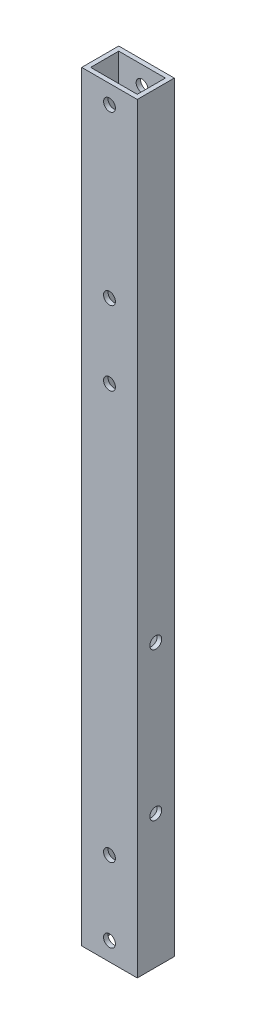
ISO-10303-21;
HEADER;
FILE_DESCRIPTION(('STEP AP214'),'2;1');
FILE_NAME('part.step','',(''),(''),'','','');
FILE_SCHEMA(('AUTOMOTIVE_DESIGN { 1 0 10303 214 1 1 1 1 }'));
ENDSEC;
DATA;
#1=APPLICATION_CONTEXT('core data for automotive mechanical design processes');
#2=APPLICATION_PROTOCOL_DEFINITION('international standard','automotive_design',2000,#1);
#3=PRODUCT_CONTEXT('',#1,'mechanical');
#4=PRODUCT('Part','Part','',(#3));
#5=PRODUCT_RELATED_PRODUCT_CATEGORY('part','',(#4));
#6=PRODUCT_DEFINITION_FORMATION('','',#4);
#7=PRODUCT_DEFINITION_CONTEXT('part definition',#1,'design');
#8=PRODUCT_DEFINITION('design','',#6,#7);
#9=PRODUCT_DEFINITION_SHAPE('','',#8);
#10=(LENGTH_UNIT() NAMED_UNIT(*) SI_UNIT(.MILLI.,.METRE.));
#11=(NAMED_UNIT(*) PLANE_ANGLE_UNIT() SI_UNIT($,.RADIAN.));
#12=(NAMED_UNIT(*) SI_UNIT($,.STERADIAN.) SOLID_ANGLE_UNIT());
#13=UNCERTAINTY_MEASURE_WITH_UNIT(LENGTH_MEASURE(1.E-05),#10,'distance_accuracy_value','');
#14=(GEOMETRIC_REPRESENTATION_CONTEXT(3) GLOBAL_UNCERTAINTY_ASSIGNED_CONTEXT((#13)) GLOBAL_UNIT_ASSIGNED_CONTEXT((#10,
#11,#12)) REPRESENTATION_CONTEXT('',''));
#15=CARTESIAN_POINT('',(0.,0.,0.));
#16=DIRECTION('',(0.,0.,1.));
#17=DIRECTION('',(1.,0.,0.));
#18=AXIS2_PLACEMENT_3D('',#15,#16,#17);
#19=CARTESIAN_POINT('',(7.5,110.,-5.));
#20=DIRECTION('',(-1.,0.,0.));
#21=DIRECTION('',(0.,0.,1.));
#22=AXIS2_PLACEMENT_3D('',#19,#20,#21);
#23=PLANE('',#22);
#24=CARTESIAN_POINT('',(7.5,-34.,0.));
#25=DIRECTION('',(-1.,0.,0.));
#26=DIRECTION('',(0.,0.,1.));
#27=AXIS2_PLACEMENT_3D('',#24,#25,#26);
#28=CIRCLE('',#27,1.6);
#29=CARTESIAN_POINT('',(7.5,-34.,1.60000000000005));
#30=VERTEX_POINT('',#29);
#31=EDGE_CURVE('E169',#30,#30,#28,.T.);
#32=ORIENTED_EDGE('',*,*,#31,.T.);
#33=EDGE_LOOP('',(#32));
#34=FACE_BOUND('',#33,.T.);
#35=CARTESIAN_POINT('',(7.5,-74.,0.));
#36=DIRECTION('',(-1.,0.,0.));
#37=DIRECTION('',(0.,0.,1.));
#38=AXIS2_PLACEMENT_3D('',#35,#36,#37);
#39=CIRCLE('',#38,1.6);
#40=CARTESIAN_POINT('',(7.5,-74.,1.60000000000007));
#41=VERTEX_POINT('',#40);
#42=EDGE_CURVE('E138',#41,#41,#39,.T.);
#43=ORIENTED_EDGE('',*,*,#42,.T.);
#44=EDGE_LOOP('',(#43));
#45=FACE_BOUND('',#44,.T.);
#46=DIRECTION('',(0.,0.,-1.));
#47=VECTOR('',#46,1.);
#48=CARTESIAN_POINT('',(7.5,95.5,5.));
#49=LINE('',#48,#47);
#50=CARTESIAN_POINT('',(7.5,95.5,5.));
#51=VERTEX_POINT('',#50);
#52=CARTESIAN_POINT('',(7.5,95.5,-5.));
#53=VERTEX_POINT('',#52);
#54=EDGE_CURVE('E96',#51,#53,#49,.T.);
#55=ORIENTED_EDGE('',*,*,#54,.F.);
#56=DIRECTION('',(0.,-1.,0.));
#57=VECTOR('',#56,1.);
#58=CARTESIAN_POINT('',(7.5,110.,5.));
#59=LINE('',#58,#57);
#60=CARTESIAN_POINT('',(7.5,-110.,5.));
#61=VERTEX_POINT('',#60);
#62=EDGE_CURVE('E106',#51,#61,#59,.T.);
#63=ORIENTED_EDGE('',*,*,#62,.T.);
#64=DIRECTION('',(0.,0.,-1.));
#65=VECTOR('',#64,1.);
#66=CARTESIAN_POINT('',(7.5,-110.,-5.));
#67=LINE('',#66,#65);
#68=CARTESIAN_POINT('',(7.5,-110.,-5.));
#69=VERTEX_POINT('',#68);
#70=EDGE_CURVE('E212',#61,#69,#67,.T.);
#71=ORIENTED_EDGE('',*,*,#70,.T.);
#72=DIRECTION('',(0.,-1.,0.));
#73=VECTOR('',#72,1.);
#74=CARTESIAN_POINT('',(7.5,110.,-5.));
#75=LINE('',#74,#73);
#76=EDGE_CURVE('E40',#53,#69,#75,.T.);
#77=ORIENTED_EDGE('',*,*,#76,.F.);
#78=EDGE_LOOP('',(#55,#63,#71,#77));
#79=FACE_BOUND('',#78,.T.);
#80=ADVANCED_FACE('F32',(#34,#45,#79),#23,.F.);
#81=CARTESIAN_POINT('',(-7.5,110.,-5.));
#82=DIRECTION('',(0.,0.,1.));
#83=DIRECTION('',(1.,0.,0.));
#84=AXIS2_PLACEMENT_3D('',#81,#82,#83);
#85=PLANE('',#84);
#86=CARTESIAN_POINT('',(0.,90.5,-5.));
#87=DIRECTION('',(0.,0.,-1.));
#88=DIRECTION('',(-1.,0.,0.));
#89=AXIS2_PLACEMENT_3D('',#86,#87,#88);
#90=CIRCLE('',#89,1.60000000000001);
#91=CARTESIAN_POINT('',(-1.60000000000001,90.5,-5.));
#92=VERTEX_POINT('',#91);
#93=EDGE_CURVE('E384',#92,#92,#90,.T.);
#94=ORIENTED_EDGE('',*,*,#93,.F.);
#95=EDGE_LOOP('',(#94));
#96=FACE_BOUND('',#95,.T.);
#97=CARTESIAN_POINT('',(0.,-105.,-5.));
#98=DIRECTION('',(0.,0.,-1.));
#99=DIRECTION('',(-1.,0.,0.));
#100=AXIS2_PLACEMENT_3D('',#97,#98,#99);
#101=CIRCLE('',#100,1.60000000000001);
#102=CARTESIAN_POINT('',(-1.60000000000001,-105.,-5.));
#103=VERTEX_POINT('',#102);
#104=EDGE_CURVE('E178',#103,#103,#101,.T.);
#105=ORIENTED_EDGE('',*,*,#104,.F.);
#106=EDGE_LOOP('',(#105));
#107=FACE_BOUND('',#106,.T.);
#108=CARTESIAN_POINT('',(0.,-85.,-5.));
#109=DIRECTION('',(0.,0.,-1.));
#110=DIRECTION('',(-1.,0.,0.));
#111=AXIS2_PLACEMENT_3D('',#108,#109,#110);
#112=CIRCLE('',#111,1.6);
#113=CARTESIAN_POINT('',(-1.6,-85.,-5.));
#114=VERTEX_POINT('',#113);
#115=EDGE_CURVE('E128',#114,#114,#112,.T.);
#116=ORIENTED_EDGE('',*,*,#115,.F.);
#117=EDGE_LOOP('',(#116));
#118=FACE_BOUND('',#117,.T.);
#119=CARTESIAN_POINT('',(0.,45.2765137036184,-5.));
#120=DIRECTION('',(0.,0.,-1.));
#121=DIRECTION('',(-1.,0.,0.));
#122=AXIS2_PLACEMENT_3D('',#119,#120,#121);
#123=CIRCLE('',#122,1.6);
#124=CARTESIAN_POINT('',(-1.6,45.2765137036184,-5.));
#125=VERTEX_POINT('',#124);
#126=EDGE_CURVE('E161',#125,#125,#123,.T.);
#127=ORIENTED_EDGE('',*,*,#126,.F.);
#128=EDGE_LOOP('',(#127));
#129=FACE_BOUND('',#128,.T.);
#130=CARTESIAN_POINT('',(0.,25.2765137036184,-5.));
#131=DIRECTION('',(0.,0.,-1.));
#132=DIRECTION('',(-1.,0.,0.));
#133=AXIS2_PLACEMENT_3D('',#130,#131,#132);
#134=CIRCLE('',#133,1.6);
#135=CARTESIAN_POINT('',(-1.6,25.2765137036184,-5.));
#136=VERTEX_POINT('',#135);
#137=EDGE_CURVE('E239',#136,#136,#134,.T.);
#138=ORIENTED_EDGE('',*,*,#137,.F.);
#139=EDGE_LOOP('',(#138));
#140=FACE_BOUND('',#139,.T.);
#141=DIRECTION('',(-1.,0.,0.));
#142=VECTOR('',#141,1.);
#143=CARTESIAN_POINT('',(7.5,95.5,-5.));
#144=LINE('',#143,#142);
#145=CARTESIAN_POINT('',(-7.5,95.5,-5.));
#146=VERTEX_POINT('',#145);
#147=EDGE_CURVE('E108',#53,#146,#144,.T.);
#148=ORIENTED_EDGE('',*,*,#147,.F.);
#149=ORIENTED_EDGE('',*,*,#76,.T.);
#150=DIRECTION('',(-1.,0.,0.));
#151=VECTOR('',#150,1.);
#152=CARTESIAN_POINT('',(-7.5,-110.,-5.));
#153=LINE('',#152,#151);
#154=CARTESIAN_POINT('',(-7.5,-110.,-5.));
#155=VERTEX_POINT('',#154);
#156=EDGE_CURVE('E214',#69,#155,#153,.T.);
#157=ORIENTED_EDGE('',*,*,#156,.T.);
#158=DIRECTION('',(0.,-1.,0.));
#159=VECTOR('',#158,1.);
#160=CARTESIAN_POINT('',(-7.5,110.,-5.));
#161=LINE('',#160,#159);
#162=EDGE_CURVE('E116',#146,#155,#161,.T.);
#163=ORIENTED_EDGE('',*,*,#162,.F.);
#164=EDGE_LOOP('',(#148,#149,#157,#163));
#165=FACE_BOUND('',#164,.T.);
#166=ADVANCED_FACE('F226',(#96,#107,#118,#129,#140,#165),#85,.F.);
#167=CARTESIAN_POINT('',(-7.5,110.,-5.));
#168=DIRECTION('',(1.,0.,0.));
#169=DIRECTION('',(0.,0.,-1.));
#170=AXIS2_PLACEMENT_3D('',#167,#168,#169);
#171=PLANE('',#170);
#172=CARTESIAN_POINT('',(-7.5,-34.,0.));
#173=DIRECTION('',(-1.,0.,0.));
#174=DIRECTION('',(0.,0.,1.));
#175=AXIS2_PLACEMENT_3D('',#172,#173,#174);
#176=CIRCLE('',#175,1.6);
#177=CARTESIAN_POINT('',(-7.5,-34.,1.60000000000005));
#178=VERTEX_POINT('',#177);
#179=EDGE_CURVE('E154',#178,#178,#176,.T.);
#180=ORIENTED_EDGE('',*,*,#179,.F.);
#181=EDGE_LOOP('',(#180));
#182=FACE_BOUND('',#181,.T.);
#183=CARTESIAN_POINT('',(-7.5,-74.,0.));
#184=DIRECTION('',(-1.,0.,0.));
#185=DIRECTION('',(0.,0.,1.));
#186=AXIS2_PLACEMENT_3D('',#183,#184,#185);
#187=CIRCLE('',#186,1.6);
#188=CARTESIAN_POINT('',(-7.5,-74.,1.60000000000008));
#189=VERTEX_POINT('',#188);
#190=EDGE_CURVE('E166',#189,#189,#187,.T.);
#191=ORIENTED_EDGE('',*,*,#190,.F.);
#192=EDGE_LOOP('',(#191));
#193=FACE_BOUND('',#192,.T.);
#194=DIRECTION('',(0.,0.,1.));
#195=VECTOR('',#194,1.);
#196=CARTESIAN_POINT('',(-7.5,95.5,-5.));
#197=LINE('',#196,#195);
#198=CARTESIAN_POINT('',(-7.5,95.5,5.));
#199=VERTEX_POINT('',#198);
#200=EDGE_CURVE('E47',#146,#199,#197,.T.);
#201=ORIENTED_EDGE('',*,*,#200,.F.);
#202=ORIENTED_EDGE('',*,*,#162,.T.);
#203=DIRECTION('',(0.,0.,1.));
#204=VECTOR('',#203,1.);
#205=CARTESIAN_POINT('',(-7.5,-110.,-5.));
#206=LINE('',#205,#204);
#207=CARTESIAN_POINT('',(-7.5,-110.,5.));
#208=VERTEX_POINT('',#207);
#209=EDGE_CURVE('E118',#155,#208,#206,.T.);
#210=ORIENTED_EDGE('',*,*,#209,.T.);
#211=DIRECTION('',(0.,-1.,0.));
#212=VECTOR('',#211,1.);
#213=CARTESIAN_POINT('',(-7.5,110.,5.));
#214=LINE('',#213,#212);
#215=EDGE_CURVE('E114',#199,#208,#214,.T.);
#216=ORIENTED_EDGE('',*,*,#215,.F.);
#217=EDGE_LOOP('',(#201,#202,#210,#216));
#218=FACE_BOUND('',#217,.T.);
#219=ADVANCED_FACE('F219',(#182,#193,#218),#171,.F.);
#220=CARTESIAN_POINT('',(-7.5,110.,5.));
#221=DIRECTION('',(0.,0.,-1.));
#222=DIRECTION('',(-1.,0.,0.));
#223=AXIS2_PLACEMENT_3D('',#220,#221,#222);
#224=PLANE('',#223);
#225=CARTESIAN_POINT('',(0.,90.5,5.));
#226=DIRECTION('',(0.,0.,-1.));
#227=DIRECTION('',(-1.,0.,0.));
#228=AXIS2_PLACEMENT_3D('',#225,#226,#227);
#229=CIRCLE('',#228,1.60000000000001);
#230=CARTESIAN_POINT('',(-1.60000000000001,90.5,5.));
#231=VERTEX_POINT('',#230);
#232=EDGE_CURVE('E101',#231,#231,#229,.T.);
#233=ORIENTED_EDGE('',*,*,#232,.T.);
#234=EDGE_LOOP('',(#233));
#235=FACE_BOUND('',#234,.T.);
#236=CARTESIAN_POINT('',(0.,-105.,5.));
#237=DIRECTION('',(0.,0.,-1.));
#238=DIRECTION('',(-1.,0.,0.));
#239=AXIS2_PLACEMENT_3D('',#236,#237,#238);
#240=CIRCLE('',#239,1.60000000000001);
#241=CARTESIAN_POINT('',(-1.60000000000001,-105.,5.));
#242=VERTEX_POINT('',#241);
#243=EDGE_CURVE('E133',#242,#242,#240,.T.);
#244=ORIENTED_EDGE('',*,*,#243,.T.);
#245=EDGE_LOOP('',(#244));
#246=FACE_BOUND('',#245,.T.);
#247=CARTESIAN_POINT('',(0.,-85.,5.));
#248=DIRECTION('',(0.,0.,-1.));
#249=DIRECTION('',(-1.,0.,0.));
#250=AXIS2_PLACEMENT_3D('',#247,#248,#249);
#251=CIRCLE('',#250,1.6);
#252=CARTESIAN_POINT('',(-1.6,-85.,5.));
#253=VERTEX_POINT('',#252);
#254=EDGE_CURVE('E189',#253,#253,#251,.T.);
#255=ORIENTED_EDGE('',*,*,#254,.T.);
#256=EDGE_LOOP('',(#255));
#257=FACE_BOUND('',#256,.T.);
#258=CARTESIAN_POINT('',(0.,45.2765137036184,5.));
#259=DIRECTION('',(0.,0.,-1.));
#260=DIRECTION('',(-1.,0.,0.));
#261=AXIS2_PLACEMENT_3D('',#258,#259,#260);
#262=CIRCLE('',#261,1.6);
#263=CARTESIAN_POINT('',(-1.6,45.2765137036184,5.));
#264=VERTEX_POINT('',#263);
#265=EDGE_CURVE('E241',#264,#264,#262,.T.);
#266=ORIENTED_EDGE('',*,*,#265,.T.);
#267=EDGE_LOOP('',(#266));
#268=FACE_BOUND('',#267,.T.);
#269=CARTESIAN_POINT('',(0.,25.2765137036184,5.));
#270=DIRECTION('',(0.,0.,-1.));
#271=DIRECTION('',(-1.,0.,0.));
#272=AXIS2_PLACEMENT_3D('',#269,#270,#271);
#273=CIRCLE('',#272,1.6);
#274=CARTESIAN_POINT('',(-1.6,25.2765137036184,5.));
#275=VERTEX_POINT('',#274);
#276=EDGE_CURVE('E147',#275,#275,#273,.T.);
#277=ORIENTED_EDGE('',*,*,#276,.T.);
#278=EDGE_LOOP('',(#277));
#279=FACE_BOUND('',#278,.T.);
#280=DIRECTION('',(1.,0.,0.));
#281=VECTOR('',#280,1.);
#282=CARTESIAN_POINT('',(-7.5,95.5,5.));
#283=LINE('',#282,#281);
#284=EDGE_CURVE('E93',#199,#51,#283,.T.);
#285=ORIENTED_EDGE('',*,*,#284,.F.);
#286=ORIENTED_EDGE('',*,*,#215,.T.);
#287=DIRECTION('',(1.,0.,0.));
#288=VECTOR('',#287,1.);
#289=CARTESIAN_POINT('',(-7.5,-110.,5.));
#290=LINE('',#289,#288);
#291=EDGE_CURVE('E112',#208,#61,#290,.T.);
#292=ORIENTED_EDGE('',*,*,#291,.T.);
#293=ORIENTED_EDGE('',*,*,#62,.F.);
#294=EDGE_LOOP('',(#285,#286,#292,#293));
#295=FACE_BOUND('',#294,.T.);
#296=ADVANCED_FACE('F110',(#235,#246,#257,#268,#279,#295),#224,.F.);
#297=CARTESIAN_POINT('',(-6.3,110.,-3.8));
#298=DIRECTION('',(1.,0.,0.));
#299=DIRECTION('',(0.,0.,-1.));
#300=AXIS2_PLACEMENT_3D('',#297,#298,#299);
#301=PLANE('',#300);
#302=CARTESIAN_POINT('',(-6.3,-74.,0.));
#303=DIRECTION('',(1.,0.,0.));
#304=DIRECTION('',(0.,0.,-1.));
#305=AXIS2_PLACEMENT_3D('',#302,#303,#304);
#306=CIRCLE('',#305,1.6);
#307=CARTESIAN_POINT('',(-6.3,-74.,-1.59999999999992));
#308=VERTEX_POINT('',#307);
#309=EDGE_CURVE('E142',#308,#308,#306,.T.);
#310=ORIENTED_EDGE('',*,*,#309,.F.);
#311=EDGE_LOOP('',(#310));
#312=FACE_BOUND('',#311,.T.);
#313=CARTESIAN_POINT('',(-6.3,-34.,0.));
#314=DIRECTION('',(1.,0.,0.));
#315=DIRECTION('',(0.,0.,-1.));
#316=AXIS2_PLACEMENT_3D('',#313,#314,#315);
#317=CIRCLE('',#316,1.6);
#318=CARTESIAN_POINT('',(-6.3,-34.,-1.59999999999995));
#319=VERTEX_POINT('',#318);
#320=EDGE_CURVE('E137',#319,#319,#317,.T.);
#321=ORIENTED_EDGE('',*,*,#320,.F.);
#322=EDGE_LOOP('',(#321));
#323=FACE_BOUND('',#322,.T.);
#324=DIRECTION('',(0.,-1.,0.));
#325=VECTOR('',#324,1.);
#326=CARTESIAN_POINT('',(-6.3,110.,-3.8));
#327=LINE('',#326,#325);
#328=CARTESIAN_POINT('',(-6.3,95.5,-3.8));
#329=VERTEX_POINT('',#328);
#330=CARTESIAN_POINT('',(-6.3,-110.,-3.8));
#331=VERTEX_POINT('',#330);
#332=EDGE_CURVE('E204',#329,#331,#327,.T.);
#333=ORIENTED_EDGE('',*,*,#332,.F.);
#334=DIRECTION('',(0.,0.,1.));
#335=VECTOR('',#334,1.);
#336=CARTESIAN_POINT('',(-6.3,95.5,-3.8));
#337=LINE('',#336,#335);
#338=CARTESIAN_POINT('',(-6.3,95.5,3.8));
#339=VERTEX_POINT('',#338);
#340=EDGE_CURVE('E55',#329,#339,#337,.T.);
#341=ORIENTED_EDGE('',*,*,#340,.T.);
#342=DIRECTION('',(0.,-1.,0.));
#343=VECTOR('',#342,1.);
#344=CARTESIAN_POINT('',(-6.3,110.,3.8));
#345=LINE('',#344,#343);
#346=CARTESIAN_POINT('',(-6.3,-110.,3.8));
#347=VERTEX_POINT('',#346);
#348=EDGE_CURVE('E210',#339,#347,#345,.T.);
#349=ORIENTED_EDGE('',*,*,#348,.T.);
#350=DIRECTION('',(0.,0.,1.));
#351=VECTOR('',#350,1.);
#352=CARTESIAN_POINT('',(-6.3,-110.,-3.8));
#353=LINE('',#352,#351);
#354=EDGE_CURVE('E192',#331,#347,#353,.T.);
#355=ORIENTED_EDGE('',*,*,#354,.F.);
#356=EDGE_LOOP('',(#333,#341,#349,#355));
#357=FACE_BOUND('',#356,.T.);
#358=ADVANCED_FACE('F306',(#312,#323,#357),#301,.T.);
#359=CARTESIAN_POINT('',(-6.3,110.,3.8));
#360=DIRECTION('',(0.,0.,-1.));
#361=DIRECTION('',(-1.,0.,0.));
#362=AXIS2_PLACEMENT_3D('',#359,#360,#361);
#363=PLANE('',#362);
#364=CARTESIAN_POINT('',(0.,90.5,3.8));
#365=DIRECTION('',(0.,0.,-1.));
#366=DIRECTION('',(-1.,0.,0.));
#367=AXIS2_PLACEMENT_3D('',#364,#365,#366);
#368=CIRCLE('',#367,1.60000000000001);
#369=CARTESIAN_POINT('',(-1.60000000000001,90.5,3.8));
#370=VERTEX_POINT('',#369);
#371=EDGE_CURVE('E386',#370,#370,#368,.T.);
#372=ORIENTED_EDGE('',*,*,#371,.F.);
#373=EDGE_LOOP('',(#372));
#374=FACE_BOUND('',#373,.T.);
#375=CARTESIAN_POINT('',(0.,25.2765137036184,3.8));
#376=DIRECTION('',(0.,0.,-1.));
#377=DIRECTION('',(-1.,0.,0.));
#378=AXIS2_PLACEMENT_3D('',#375,#376,#377);
#379=CIRCLE('',#378,1.6);
#380=CARTESIAN_POINT('',(-1.6,25.2765137036184,3.8));
#381=VERTEX_POINT('',#380);
#382=EDGE_CURVE('E150',#381,#381,#379,.T.);
#383=ORIENTED_EDGE('',*,*,#382,.F.);
#384=EDGE_LOOP('',(#383));
#385=FACE_BOUND('',#384,.T.);
#386=CARTESIAN_POINT('',(0.,45.2765137036184,3.8));
#387=DIRECTION('',(0.,0.,-1.));
#388=DIRECTION('',(-1.,0.,0.));
#389=AXIS2_PLACEMENT_3D('',#386,#387,#388);
#390=CIRCLE('',#389,1.6);
#391=CARTESIAN_POINT('',(-1.6,45.2765137036184,3.8));
#392=VERTEX_POINT('',#391);
#393=EDGE_CURVE('E146',#392,#392,#390,.T.);
#394=ORIENTED_EDGE('',*,*,#393,.F.);
#395=EDGE_LOOP('',(#394));
#396=FACE_BOUND('',#395,.T.);
#397=CARTESIAN_POINT('',(0.,-85.,3.8));
#398=DIRECTION('',(0.,0.,-1.));
#399=DIRECTION('',(-1.,0.,0.));
#400=AXIS2_PLACEMENT_3D('',#397,#398,#399);
#401=CIRCLE('',#400,1.6);
#402=CARTESIAN_POINT('',(-1.6,-85.,3.8));
#403=VERTEX_POINT('',#402);
#404=EDGE_CURVE('E132',#403,#403,#401,.T.);
#405=ORIENTED_EDGE('',*,*,#404,.F.);
#406=EDGE_LOOP('',(#405));
#407=FACE_BOUND('',#406,.T.);
#408=CARTESIAN_POINT('',(0.,-105.,3.8));
#409=DIRECTION('',(0.,0.,-1.));
#410=DIRECTION('',(-1.,0.,0.));
#411=AXIS2_PLACEMENT_3D('',#408,#409,#410);
#412=CIRCLE('',#411,1.60000000000001);
#413=CARTESIAN_POINT('',(-1.60000000000001,-105.,3.8));
#414=VERTEX_POINT('',#413);
#415=EDGE_CURVE('E127',#414,#414,#412,.T.);
#416=ORIENTED_EDGE('',*,*,#415,.F.);
#417=EDGE_LOOP('',(#416));
#418=FACE_BOUND('',#417,.T.);
#419=ORIENTED_EDGE('',*,*,#348,.F.);
#420=DIRECTION('',(1.,0.,0.));
#421=VECTOR('',#420,1.);
#422=CARTESIAN_POINT('',(-6.3,95.5,3.8));
#423=LINE('',#422,#421);
#424=CARTESIAN_POINT('',(6.3,95.5,3.8));
#425=VERTEX_POINT('',#424);
#426=EDGE_CURVE('E233',#339,#425,#423,.T.);
#427=ORIENTED_EDGE('',*,*,#426,.T.);
#428=DIRECTION('',(0.,-1.,0.));
#429=VECTOR('',#428,1.);
#430=CARTESIAN_POINT('',(6.3,110.,3.8));
#431=LINE('',#430,#429);
#432=CARTESIAN_POINT('',(6.3,-110.,3.8));
#433=VERTEX_POINT('',#432);
#434=EDGE_CURVE('E208',#425,#433,#431,.T.);
#435=ORIENTED_EDGE('',*,*,#434,.T.);
#436=DIRECTION('',(1.,0.,0.));
#437=VECTOR('',#436,1.);
#438=CARTESIAN_POINT('',(-6.3,-110.,3.8));
#439=LINE('',#438,#437);
#440=EDGE_CURVE('E195',#347,#433,#439,.T.);
#441=ORIENTED_EDGE('',*,*,#440,.F.);
#442=EDGE_LOOP('',(#419,#427,#435,#441));
#443=FACE_BOUND('',#442,.T.);
#444=ADVANCED_FACE('F317',(#374,#385,#396,#407,#418,#443),#363,.T.);
#445=CARTESIAN_POINT('',(6.3,110.,-3.8));
#446=DIRECTION('',(-1.,0.,0.));
#447=DIRECTION('',(0.,0.,1.));
#448=AXIS2_PLACEMENT_3D('',#445,#446,#447);
#449=PLANE('',#448);
#450=CARTESIAN_POINT('',(6.3,-74.,0.));
#451=DIRECTION('',(-1.,0.,0.));
#452=DIRECTION('',(0.,0.,1.));
#453=AXIS2_PLACEMENT_3D('',#450,#451,#452);
#454=CIRCLE('',#453,1.6);
#455=CARTESIAN_POINT('',(6.3,-74.,1.60000000000007));
#456=VERTEX_POINT('',#455);
#457=EDGE_CURVE('E139',#456,#456,#454,.T.);
#458=ORIENTED_EDGE('',*,*,#457,.F.);
#459=EDGE_LOOP('',(#458));
#460=FACE_BOUND('',#459,.T.);
#461=CARTESIAN_POINT('',(6.3,-34.,0.));
#462=DIRECTION('',(-1.,0.,0.));
#463=DIRECTION('',(0.,0.,1.));
#464=AXIS2_PLACEMENT_3D('',#461,#462,#463);
#465=CIRCLE('',#464,1.6);
#466=CARTESIAN_POINT('',(6.3,-34.,1.60000000000005));
#467=VERTEX_POINT('',#466);
#468=EDGE_CURVE('E134',#467,#467,#465,.T.);
#469=ORIENTED_EDGE('',*,*,#468,.F.);
#470=EDGE_LOOP('',(#469));
#471=FACE_BOUND('',#470,.T.);
#472=ORIENTED_EDGE('',*,*,#434,.F.);
#473=DIRECTION('',(0.,0.,-1.));
#474=VECTOR('',#473,1.);
#475=CARTESIAN_POINT('',(6.3,95.5,-3.8));
#476=LINE('',#475,#474);
#477=CARTESIAN_POINT('',(6.3,95.5,-3.8));
#478=VERTEX_POINT('',#477);
#479=EDGE_CURVE('E228',#425,#478,#476,.T.);
#480=ORIENTED_EDGE('',*,*,#479,.T.);
#481=DIRECTION('',(0.,-1.,0.));
#482=VECTOR('',#481,1.);
#483=CARTESIAN_POINT('',(6.3,110.,-3.8));
#484=LINE('',#483,#482);
#485=CARTESIAN_POINT('',(6.3,-110.,-3.8));
#486=VERTEX_POINT('',#485);
#487=EDGE_CURVE('E206',#478,#486,#484,.T.);
#488=ORIENTED_EDGE('',*,*,#487,.T.);
#489=DIRECTION('',(0.,0.,-1.));
#490=VECTOR('',#489,1.);
#491=CARTESIAN_POINT('',(6.3,-110.,-3.8));
#492=LINE('',#491,#490);
#493=EDGE_CURVE('E198',#433,#486,#492,.T.);
#494=ORIENTED_EDGE('',*,*,#493,.F.);
#495=EDGE_LOOP('',(#472,#480,#488,#494));
#496=FACE_BOUND('',#495,.T.);
#497=ADVANCED_FACE('F321',(#460,#471,#496),#449,.T.);
#498=CARTESIAN_POINT('',(-6.3,110.,-3.8));
#499=DIRECTION('',(0.,0.,1.));
#500=DIRECTION('',(1.,0.,0.));
#501=AXIS2_PLACEMENT_3D('',#498,#499,#500);
#502=PLANE('',#501);
#503=CARTESIAN_POINT('',(0.,90.5,-3.8));
#504=DIRECTION('',(0.,0.,1.));
#505=DIRECTION('',(1.,0.,0.));
#506=AXIS2_PLACEMENT_3D('',#503,#504,#505);
#507=CIRCLE('',#506,1.60000000000001);
#508=CARTESIAN_POINT('',(1.60000000000001,90.5,-3.8));
#509=VERTEX_POINT('',#508);
#510=EDGE_CURVE('E35',#509,#509,#507,.T.);
#511=ORIENTED_EDGE('',*,*,#510,.F.);
#512=EDGE_LOOP('',(#511));
#513=FACE_BOUND('',#512,.T.);
#514=CARTESIAN_POINT('',(0.,25.2765137036184,-3.8));
#515=DIRECTION('',(0.,0.,1.));
#516=DIRECTION('',(1.,0.,0.));
#517=AXIS2_PLACEMENT_3D('',#514,#515,#516);
#518=CIRCLE('',#517,1.6);
#519=CARTESIAN_POINT('',(1.6,25.2765137036184,-3.8));
#520=VERTEX_POINT('',#519);
#521=EDGE_CURVE('E148',#520,#520,#518,.T.);
#522=ORIENTED_EDGE('',*,*,#521,.F.);
#523=EDGE_LOOP('',(#522));
#524=FACE_BOUND('',#523,.T.);
#525=CARTESIAN_POINT('',(0.,45.2765137036184,-3.8));
#526=DIRECTION('',(0.,0.,1.));
#527=DIRECTION('',(1.,0.,0.));
#528=AXIS2_PLACEMENT_3D('',#525,#526,#527);
#529=CIRCLE('',#528,1.6);
#530=CARTESIAN_POINT('',(1.6,45.2765137036184,-3.8));
#531=VERTEX_POINT('',#530);
#532=EDGE_CURVE('E143',#531,#531,#529,.T.);
#533=ORIENTED_EDGE('',*,*,#532,.F.);
#534=EDGE_LOOP('',(#533));
#535=FACE_BOUND('',#534,.T.);
#536=CARTESIAN_POINT('',(0.,-85.,-3.8));
#537=DIRECTION('',(0.,0.,1.));
#538=DIRECTION('',(1.,0.,0.));
#539=AXIS2_PLACEMENT_3D('',#536,#537,#538);
#540=CIRCLE('',#539,1.6);
#541=CARTESIAN_POINT('',(1.6,-85.,-3.8));
#542=VERTEX_POINT('',#541);
#543=EDGE_CURVE('E129',#542,#542,#540,.T.);
#544=ORIENTED_EDGE('',*,*,#543,.F.);
#545=EDGE_LOOP('',(#544));
#546=FACE_BOUND('',#545,.T.);
#547=CARTESIAN_POINT('',(0.,-105.,-3.8));
#548=DIRECTION('',(0.,0.,1.));
#549=DIRECTION('',(1.,0.,0.));
#550=AXIS2_PLACEMENT_3D('',#547,#548,#549);
#551=CIRCLE('',#550,1.60000000000001);
#552=CARTESIAN_POINT('',(1.60000000000001,-105.,-3.8));
#553=VERTEX_POINT('',#552);
#554=EDGE_CURVE('E124',#553,#553,#551,.T.);
#555=ORIENTED_EDGE('',*,*,#554,.F.);
#556=EDGE_LOOP('',(#555));
#557=FACE_BOUND('',#556,.T.);
#558=ORIENTED_EDGE('',*,*,#487,.F.);
#559=DIRECTION('',(-1.,0.,0.));
#560=VECTOR('',#559,1.);
#561=CARTESIAN_POINT('',(-6.3,95.5,-3.8));
#562=LINE('',#561,#560);
#563=EDGE_CURVE('E11',#478,#329,#562,.T.);
#564=ORIENTED_EDGE('',*,*,#563,.T.);
#565=ORIENTED_EDGE('',*,*,#332,.T.);
#566=DIRECTION('',(-1.,0.,0.));
#567=VECTOR('',#566,1.);
#568=CARTESIAN_POINT('',(-6.3,-110.,-3.8));
#569=LINE('',#568,#567);
#570=EDGE_CURVE('E201',#486,#331,#569,.T.);
#571=ORIENTED_EDGE('',*,*,#570,.F.);
#572=EDGE_LOOP('',(#558,#564,#565,#571));
#573=FACE_BOUND('',#572,.T.);
#574=ADVANCED_FACE('F314',(#513,#524,#535,#546,#557,#573),#502,.T.);
#575=CARTESIAN_POINT('',(0.,-110.,0.));
#576=DIRECTION('',(0.,1.,0.));
#577=DIRECTION('',(0.,0.,1.));
#578=AXIS2_PLACEMENT_3D('',#575,#576,#577);
#579=PLANE('',#578);
#580=ORIENTED_EDGE('',*,*,#70,.F.);
#581=ORIENTED_EDGE('',*,*,#291,.F.);
#582=ORIENTED_EDGE('',*,*,#209,.F.);
#583=ORIENTED_EDGE('',*,*,#156,.F.);
#584=EDGE_LOOP('',(#580,#581,#582,#583));
#585=FACE_BOUND('',#584,.T.);
#586=ORIENTED_EDGE('',*,*,#354,.T.);
#587=ORIENTED_EDGE('',*,*,#440,.T.);
#588=ORIENTED_EDGE('',*,*,#493,.T.);
#589=ORIENTED_EDGE('',*,*,#570,.T.);
#590=EDGE_LOOP('',(#586,#587,#588,#589));
#591=FACE_BOUND('',#590,.T.);
#592=ADVANCED_FACE('F223',(#585,#591),#579,.F.);
#593=CARTESIAN_POINT('',(0.,-105.,95.));
#594=DIRECTION('',(0.,0.,-1.));
#595=DIRECTION('',(-1.,0.,0.));
#596=AXIS2_PLACEMENT_3D('',#593,#594,#595);
#597=CYLINDRICAL_SURFACE('',#596,1.60000000000001);
#598=ORIENTED_EDGE('',*,*,#554,.T.);
#599=EDGE_LOOP('',(#598));
#600=FACE_BOUND('',#599,.T.);
#601=ORIENTED_EDGE('',*,*,#104,.T.);
#602=EDGE_LOOP('',(#601));
#603=FACE_BOUND('',#602,.T.);
#604=ADVANCED_FACE('F313',(#600,#603),#597,.F.);
#605=CARTESIAN_POINT('',(0.,-85.,95.));
#606=DIRECTION('',(0.,0.,-1.));
#607=DIRECTION('',(-1.,0.,0.));
#608=AXIS2_PLACEMENT_3D('',#605,#606,#607);
#609=CYLINDRICAL_SURFACE('',#608,1.6);
#610=ORIENTED_EDGE('',*,*,#543,.T.);
#611=EDGE_LOOP('',(#610));
#612=FACE_BOUND('',#611,.T.);
#613=ORIENTED_EDGE('',*,*,#115,.T.);
#614=EDGE_LOOP('',(#613));
#615=FACE_BOUND('',#614,.T.);
#616=ADVANCED_FACE('F331',(#612,#615),#609,.F.);
#617=ORIENTED_EDGE('',*,*,#415,.T.);
#618=EDGE_LOOP('',(#617));
#619=FACE_BOUND('',#618,.T.);
#620=ORIENTED_EDGE('',*,*,#243,.F.);
#621=EDGE_LOOP('',(#620));
#622=FACE_BOUND('',#621,.T.);
#623=ADVANCED_FACE('F333',(#619,#622),#597,.F.);
#624=ORIENTED_EDGE('',*,*,#404,.T.);
#625=EDGE_LOOP('',(#624));
#626=FACE_BOUND('',#625,.T.);
#627=ORIENTED_EDGE('',*,*,#254,.F.);
#628=EDGE_LOOP('',(#627));
#629=FACE_BOUND('',#628,.T.);
#630=ADVANCED_FACE('F290',(#626,#629),#609,.F.);
#631=CARTESIAN_POINT('',(7.5,-34.,0.));
#632=DIRECTION('',(-1.,0.,0.));
#633=DIRECTION('',(0.,0.,1.));
#634=AXIS2_PLACEMENT_3D('',#631,#632,#633);
#635=CYLINDRICAL_SURFACE('',#634,1.6);
#636=ORIENTED_EDGE('',*,*,#468,.T.);
#637=EDGE_LOOP('',(#636));
#638=FACE_BOUND('',#637,.T.);
#639=ORIENTED_EDGE('',*,*,#31,.F.);
#640=EDGE_LOOP('',(#639));
#641=FACE_BOUND('',#640,.T.);
#642=ADVANCED_FACE('F281',(#638,#641),#635,.F.);
#643=CARTESIAN_POINT('',(7.5,-74.,0.));
#644=DIRECTION('',(-1.,0.,0.));
#645=DIRECTION('',(0.,0.,1.));
#646=AXIS2_PLACEMENT_3D('',#643,#644,#645);
#647=CYLINDRICAL_SURFACE('',#646,1.6);
#648=ORIENTED_EDGE('',*,*,#457,.T.);
#649=EDGE_LOOP('',(#648));
#650=FACE_BOUND('',#649,.T.);
#651=ORIENTED_EDGE('',*,*,#42,.F.);
#652=EDGE_LOOP('',(#651));
#653=FACE_BOUND('',#652,.T.);
#654=ADVANCED_FACE('F278',(#650,#653),#647,.F.);
#655=ORIENTED_EDGE('',*,*,#320,.T.);
#656=EDGE_LOOP('',(#655));
#657=FACE_BOUND('',#656,.T.);
#658=ORIENTED_EDGE('',*,*,#179,.T.);
#659=EDGE_LOOP('',(#658));
#660=FACE_BOUND('',#659,.T.);
#661=ADVANCED_FACE('F280',(#657,#660),#635,.F.);
#662=ORIENTED_EDGE('',*,*,#309,.T.);
#663=EDGE_LOOP('',(#662));
#664=FACE_BOUND('',#663,.T.);
#665=ORIENTED_EDGE('',*,*,#190,.T.);
#666=EDGE_LOOP('',(#665));
#667=FACE_BOUND('',#666,.T.);
#668=ADVANCED_FACE('F265',(#664,#667),#647,.F.);
#669=CARTESIAN_POINT('',(0.,45.2765137036184,5.));
#670=DIRECTION('',(0.,0.,-1.));
#671=DIRECTION('',(-1.,0.,0.));
#672=AXIS2_PLACEMENT_3D('',#669,#670,#671);
#673=CYLINDRICAL_SURFACE('',#672,1.6);
#674=ORIENTED_EDGE('',*,*,#532,.T.);
#675=EDGE_LOOP('',(#674));
#676=FACE_BOUND('',#675,.T.);
#677=ORIENTED_EDGE('',*,*,#126,.T.);
#678=EDGE_LOOP('',(#677));
#679=FACE_BOUND('',#678,.T.);
#680=ADVANCED_FACE('F248',(#676,#679),#673,.F.);
#681=CARTESIAN_POINT('',(0.,25.2765137036184,5.));
#682=DIRECTION('',(0.,0.,-1.));
#683=DIRECTION('',(-1.,0.,0.));
#684=AXIS2_PLACEMENT_3D('',#681,#682,#683);
#685=CYLINDRICAL_SURFACE('',#684,1.6);
#686=ORIENTED_EDGE('',*,*,#521,.T.);
#687=EDGE_LOOP('',(#686));
#688=FACE_BOUND('',#687,.T.);
#689=ORIENTED_EDGE('',*,*,#137,.T.);
#690=EDGE_LOOP('',(#689));
#691=FACE_BOUND('',#690,.T.);
#692=ADVANCED_FACE('F255',(#688,#691),#685,.F.);
#693=ORIENTED_EDGE('',*,*,#393,.T.);
#694=EDGE_LOOP('',(#693));
#695=FACE_BOUND('',#694,.T.);
#696=ORIENTED_EDGE('',*,*,#265,.F.);
#697=EDGE_LOOP('',(#696));
#698=FACE_BOUND('',#697,.T.);
#699=ADVANCED_FACE('F257',(#695,#698),#673,.F.);
#700=ORIENTED_EDGE('',*,*,#382,.T.);
#701=EDGE_LOOP('',(#700));
#702=FACE_BOUND('',#701,.T.);
#703=ORIENTED_EDGE('',*,*,#276,.F.);
#704=EDGE_LOOP('',(#703));
#705=FACE_BOUND('',#704,.T.);
#706=ADVANCED_FACE('F259',(#702,#705),#685,.F.);
#707=CARTESIAN_POINT('',(0.,95.5,0.));
#708=DIRECTION('',(0.,1.,0.));
#709=DIRECTION('',(0.,0.,1.));
#710=AXIS2_PLACEMENT_3D('',#707,#708,#709);
#711=PLANE('',#710);
#712=ORIENTED_EDGE('',*,*,#563,.F.);
#713=ORIENTED_EDGE('',*,*,#479,.F.);
#714=ORIENTED_EDGE('',*,*,#426,.F.);
#715=ORIENTED_EDGE('',*,*,#340,.F.);
#716=EDGE_LOOP('',(#712,#713,#714,#715));
#717=FACE_BOUND('',#716,.T.);
#718=ORIENTED_EDGE('',*,*,#284,.T.);
#719=ORIENTED_EDGE('',*,*,#54,.T.);
#720=ORIENTED_EDGE('',*,*,#147,.T.);
#721=ORIENTED_EDGE('',*,*,#200,.T.);
#722=EDGE_LOOP('',(#718,#719,#720,#721));
#723=FACE_BOUND('',#722,.T.);
#724=ADVANCED_FACE('F95',(#717,#723),#711,.T.);
#725=CARTESIAN_POINT('',(0.,90.5,10.));
#726=DIRECTION('',(0.,0.,-1.));
#727=DIRECTION('',(-1.,0.,0.));
#728=AXIS2_PLACEMENT_3D('',#725,#726,#727);
#729=CYLINDRICAL_SURFACE('',#728,1.60000000000001);
#730=ORIENTED_EDGE('',*,*,#510,.T.);
#731=EDGE_LOOP('',(#730));
#732=FACE_BOUND('',#731,.T.);
#733=ORIENTED_EDGE('',*,*,#93,.T.);
#734=EDGE_LOOP('',(#733));
#735=FACE_BOUND('',#734,.T.);
#736=ADVANCED_FACE('F368',(#732,#735),#729,.F.);
#737=ORIENTED_EDGE('',*,*,#371,.T.);
#738=EDGE_LOOP('',(#737));
#739=FACE_BOUND('',#738,.T.);
#740=ORIENTED_EDGE('',*,*,#232,.F.);
#741=EDGE_LOOP('',(#740));
#742=FACE_BOUND('',#741,.T.);
#743=ADVANCED_FACE('F372',(#739,#742),#729,.F.);
#744=CLOSED_SHELL('',(#80,#166,#219,#296,#358,#444,#497,#574,#592,#604,#616,#623,#630,#642,#654,
#661,#668,#680,#692,#699,#706,#724,#736,#743));
#745=MANIFOLD_SOLID_BREP('B2',#744);
#746=ADVANCED_BREP_SHAPE_REPRESENTATION('',(#18,#745),#14);
#747=SHAPE_DEFINITION_REPRESENTATION(#9,#746);
ENDSEC;
END-ISO-10303-21;
